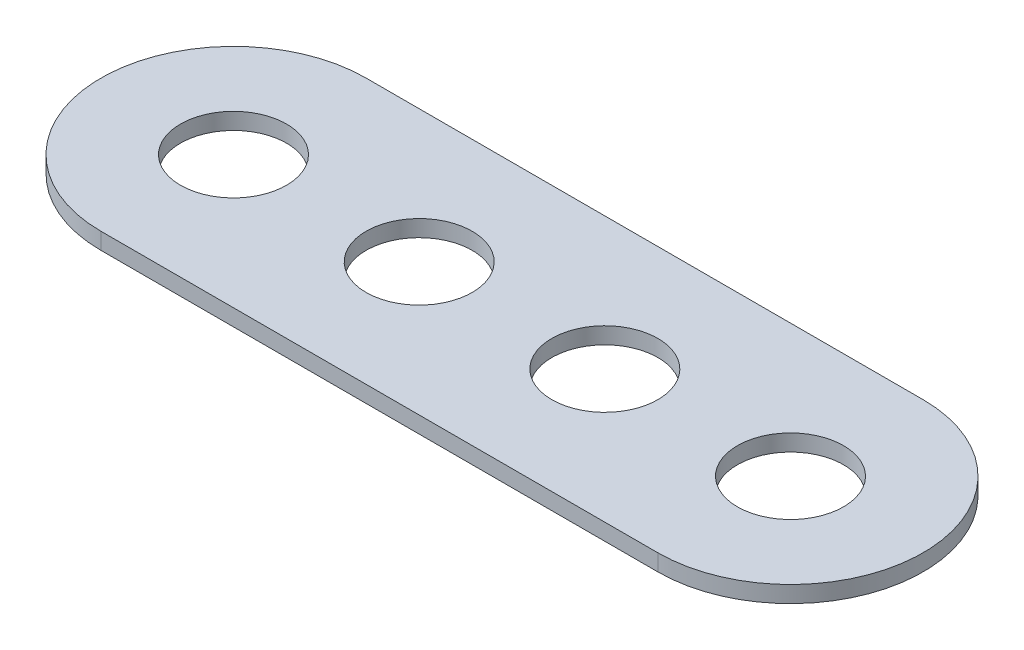
ISO-10303-21;
HEADER;
FILE_DESCRIPTION(('STEP AP214'),'2;1');
FILE_NAME('part.step','',(''),(''),'','','');
FILE_SCHEMA(('AUTOMOTIVE_DESIGN { 1 0 10303 214 1 1 1 1 }'));
ENDSEC;
DATA;
#1=APPLICATION_CONTEXT('core data for automotive mechanical design processes');
#2=APPLICATION_PROTOCOL_DEFINITION('international standard','automotive_design',2000,#1);
#3=PRODUCT_CONTEXT('',#1,'mechanical');
#4=PRODUCT('Part','Part','',(#3));
#5=PRODUCT_RELATED_PRODUCT_CATEGORY('part','',(#4));
#6=PRODUCT_DEFINITION_FORMATION('','',#4);
#7=PRODUCT_DEFINITION_CONTEXT('part definition',#1,'design');
#8=PRODUCT_DEFINITION('design','',#6,#7);
#9=PRODUCT_DEFINITION_SHAPE('','',#8);
#10=(LENGTH_UNIT() NAMED_UNIT(*) SI_UNIT(.MILLI.,.METRE.));
#11=(NAMED_UNIT(*) PLANE_ANGLE_UNIT() SI_UNIT($,.RADIAN.));
#12=(NAMED_UNIT(*) SI_UNIT($,.STERADIAN.) SOLID_ANGLE_UNIT());
#13=UNCERTAINTY_MEASURE_WITH_UNIT(LENGTH_MEASURE(1.E-05),#10,'distance_accuracy_value','');
#14=(GEOMETRIC_REPRESENTATION_CONTEXT(3) GLOBAL_UNCERTAINTY_ASSIGNED_CONTEXT((#13)) GLOBAL_UNIT_ASSIGNED_CONTEXT((#10,
#11,#12)) REPRESENTATION_CONTEXT('',''));
#15=CARTESIAN_POINT('',(0.,0.,0.));
#16=DIRECTION('',(0.,0.,1.));
#17=DIRECTION('',(1.,0.,0.));
#18=AXIS2_PLACEMENT_3D('',#15,#16,#17);
#19=CARTESIAN_POINT('',(0.,0.,0.));
#20=DIRECTION('',(0.,1.,0.));
#21=DIRECTION('',(0.,0.,1.));
#22=AXIS2_PLACEMENT_3D('',#19,#20,#21);
#23=CYLINDRICAL_SURFACE('',#22,10.16);
#24=CARTESIAN_POINT('',(0.,0.,0.));
#25=DIRECTION('',(0.,1.,0.));
#26=DIRECTION('',(0.,0.,1.));
#27=AXIS2_PLACEMENT_3D('',#24,#25,#26);
#28=CIRCLE('',#27,10.16);
#29=CARTESIAN_POINT('',(0.,0.,10.16));
#30=VERTEX_POINT('',#29);
#31=EDGE_CURVE('E48',#30,#30,#28,.T.);
#32=ORIENTED_EDGE('',*,*,#31,.F.);
#33=EDGE_LOOP('',(#32));
#34=FACE_BOUND('',#33,.T.);
#35=CARTESIAN_POINT('',(0.,3.175,0.));
#36=DIRECTION('',(0.,1.,0.));
#37=DIRECTION('',(0.,0.,1.));
#38=AXIS2_PLACEMENT_3D('',#35,#36,#37);
#39=CIRCLE('',#38,10.16);
#40=CARTESIAN_POINT('',(0.,3.175,10.16));
#41=VERTEX_POINT('',#40);
#42=EDGE_CURVE('E11',#41,#41,#39,.T.);
#43=ORIENTED_EDGE('',*,*,#42,.T.);
#44=EDGE_LOOP('',(#43));
#45=FACE_BOUND('',#44,.T.);
#46=ADVANCED_FACE('F39',(#34,#45),#23,.F.);
#47=CARTESIAN_POINT('',(-35.56,0.,0.));
#48=DIRECTION('',(0.,1.,0.));
#49=DIRECTION('',(0.,0.,1.));
#50=AXIS2_PLACEMENT_3D('',#47,#48,#49);
#51=CYLINDRICAL_SURFACE('',#50,10.16);
#52=CARTESIAN_POINT('',(-35.56,0.,0.));
#53=DIRECTION('',(0.,1.,0.));
#54=DIRECTION('',(0.,0.,1.));
#55=AXIS2_PLACEMENT_3D('',#52,#53,#54);
#56=CIRCLE('',#55,10.16);
#57=CARTESIAN_POINT('',(-35.56,0.,10.16));
#58=VERTEX_POINT('',#57);
#59=EDGE_CURVE('E136',#58,#58,#56,.T.);
#60=ORIENTED_EDGE('',*,*,#59,.F.);
#61=EDGE_LOOP('',(#60));
#62=FACE_BOUND('',#61,.T.);
#63=CARTESIAN_POINT('',(-35.56,3.175,0.));
#64=DIRECTION('',(0.,1.,0.));
#65=DIRECTION('',(0.,0.,1.));
#66=AXIS2_PLACEMENT_3D('',#63,#64,#65);
#67=CIRCLE('',#66,10.16);
#68=CARTESIAN_POINT('',(-35.56,3.175,10.16));
#69=VERTEX_POINT('',#68);
#70=EDGE_CURVE('E140',#69,#69,#67,.T.);
#71=ORIENTED_EDGE('',*,*,#70,.T.);
#72=EDGE_LOOP('',(#71));
#73=FACE_BOUND('',#72,.T.);
#74=ADVANCED_FACE('F152',(#62,#73),#51,.F.);
#75=CARTESIAN_POINT('',(-71.12,0.,0.));
#76=DIRECTION('',(0.,1.,0.));
#77=DIRECTION('',(0.,0.,1.));
#78=AXIS2_PLACEMENT_3D('',#75,#76,#77);
#79=CYLINDRICAL_SURFACE('',#78,10.16);
#80=CARTESIAN_POINT('',(-71.12,0.,0.));
#81=DIRECTION('',(0.,1.,0.));
#82=DIRECTION('',(0.,0.,1.));
#83=AXIS2_PLACEMENT_3D('',#80,#81,#82);
#84=CIRCLE('',#83,10.16);
#85=CARTESIAN_POINT('',(-71.12,0.,10.16));
#86=VERTEX_POINT('',#85);
#87=EDGE_CURVE('E128',#86,#86,#84,.T.);
#88=ORIENTED_EDGE('',*,*,#87,.F.);
#89=EDGE_LOOP('',(#88));
#90=FACE_BOUND('',#89,.T.);
#91=CARTESIAN_POINT('',(-71.12,3.175,0.));
#92=DIRECTION('',(0.,1.,0.));
#93=DIRECTION('',(0.,0.,1.));
#94=AXIS2_PLACEMENT_3D('',#91,#92,#93);
#95=CIRCLE('',#94,10.16);
#96=CARTESIAN_POINT('',(-71.12,3.175,10.16));
#97=VERTEX_POINT('',#96);
#98=EDGE_CURVE('E132',#97,#97,#95,.T.);
#99=ORIENTED_EDGE('',*,*,#98,.T.);
#100=EDGE_LOOP('',(#99));
#101=FACE_BOUND('',#100,.T.);
#102=ADVANCED_FACE('F194',(#90,#101),#79,.F.);
#103=CARTESIAN_POINT('',(0.,3.175,0.));
#104=DIRECTION('',(0.,-1.,0.));
#105=DIRECTION('',(0.,0.,-1.));
#106=AXIS2_PLACEMENT_3D('',#103,#104,#105);
#107=CYLINDRICAL_SURFACE('',#106,25.4);
#108=CARTESIAN_POINT('',(0.,0.,0.));
#109=DIRECTION('',(0.,1.,0.));
#110=DIRECTION('',(0.,0.,1.));
#111=AXIS2_PLACEMENT_3D('',#108,#109,#110);
#112=CIRCLE('',#111,25.4);
#113=CARTESIAN_POINT('',(0.,0.,25.4));
#114=VERTEX_POINT('',#113);
#115=CARTESIAN_POINT('',(0.,0.,-25.4));
#116=VERTEX_POINT('',#115);
#117=EDGE_CURVE('E111',#114,#116,#112,.T.);
#118=ORIENTED_EDGE('',*,*,#117,.T.);
#119=DIRECTION('',(0.,-1.,0.));
#120=VECTOR('',#119,1.);
#121=CARTESIAN_POINT('',(0.,3.175,-25.4));
#122=LINE('',#121,#120);
#123=CARTESIAN_POINT('',(0.,3.175,-25.4));
#124=VERTEX_POINT('',#123);
#125=EDGE_CURVE('E100',#124,#116,#122,.T.);
#126=ORIENTED_EDGE('',*,*,#125,.F.);
#127=CARTESIAN_POINT('',(0.,3.175,0.));
#128=DIRECTION('',(0.,1.,0.));
#129=DIRECTION('',(0.,0.,1.));
#130=AXIS2_PLACEMENT_3D('',#127,#128,#129);
#131=CIRCLE('',#130,25.4);
#132=CARTESIAN_POINT('',(0.,3.175,25.4));
#133=VERTEX_POINT('',#132);
#134=EDGE_CURVE('E92',#133,#124,#131,.T.);
#135=ORIENTED_EDGE('',*,*,#134,.F.);
#136=DIRECTION('',(0.,-1.,0.));
#137=VECTOR('',#136,1.);
#138=CARTESIAN_POINT('',(0.,3.175,25.4));
#139=LINE('',#138,#137);
#140=EDGE_CURVE('E107',#133,#114,#139,.T.);
#141=ORIENTED_EDGE('',*,*,#140,.T.);
#142=EDGE_LOOP('',(#118,#126,#135,#141));
#143=FACE_BOUND('',#142,.T.);
#144=ADVANCED_FACE('F191',(#143),#107,.T.);
#145=CARTESIAN_POINT('',(0.,3.175,-25.4));
#146=DIRECTION('',(0.,0.,1.));
#147=DIRECTION('',(1.,0.,0.));
#148=AXIS2_PLACEMENT_3D('',#145,#146,#147);
#149=PLANE('',#148);
#150=DIRECTION('',(-1.,0.,0.));
#151=VECTOR('',#150,1.);
#152=CARTESIAN_POINT('',(0.,0.,-25.4));
#153=LINE('',#152,#151);
#154=CARTESIAN_POINT('',(-106.68,0.,-25.4));
#155=VERTEX_POINT('',#154);
#156=EDGE_CURVE('E98',#116,#155,#153,.T.);
#157=ORIENTED_EDGE('',*,*,#156,.T.);
#158=DIRECTION('',(0.,-1.,0.));
#159=VECTOR('',#158,1.);
#160=CARTESIAN_POINT('',(-106.68,3.175,-25.4));
#161=LINE('',#160,#159);
#162=CARTESIAN_POINT('',(-106.68,3.175,-25.4));
#163=VERTEX_POINT('',#162);
#164=EDGE_CURVE('E96',#163,#155,#161,.T.);
#165=ORIENTED_EDGE('',*,*,#164,.F.);
#166=DIRECTION('',(-1.,0.,0.));
#167=VECTOR('',#166,1.);
#168=CARTESIAN_POINT('',(0.,3.175,-25.4));
#169=LINE('',#168,#167);
#170=EDGE_CURVE('E87',#124,#163,#169,.T.);
#171=ORIENTED_EDGE('',*,*,#170,.F.);
#172=ORIENTED_EDGE('',*,*,#125,.T.);
#173=EDGE_LOOP('',(#157,#165,#171,#172));
#174=FACE_BOUND('',#173,.T.);
#175=ADVANCED_FACE('F97',(#174),#149,.F.);
#176=CARTESIAN_POINT('',(-106.68,3.175,0.));
#177=DIRECTION('',(0.,-1.,0.));
#178=DIRECTION('',(0.,0.,-1.));
#179=AXIS2_PLACEMENT_3D('',#176,#177,#178);
#180=CYLINDRICAL_SURFACE('',#179,25.4);
#181=CARTESIAN_POINT('',(-106.68,0.,0.));
#182=DIRECTION('',(0.,1.,0.));
#183=DIRECTION('',(0.,0.,1.));
#184=AXIS2_PLACEMENT_3D('',#181,#182,#183);
#185=CIRCLE('',#184,25.4);
#186=CARTESIAN_POINT('',(-106.68,0.,25.4));
#187=VERTEX_POINT('',#186);
#188=EDGE_CURVE('E73',#155,#187,#185,.T.);
#189=ORIENTED_EDGE('',*,*,#188,.T.);
#190=DIRECTION('',(0.,-1.,0.));
#191=VECTOR('',#190,1.);
#192=CARTESIAN_POINT('',(-106.68,3.175,25.4));
#193=LINE('',#192,#191);
#194=CARTESIAN_POINT('',(-106.68,3.175,25.4));
#195=VERTEX_POINT('',#194);
#196=EDGE_CURVE('E101',#195,#187,#193,.T.);
#197=ORIENTED_EDGE('',*,*,#196,.F.);
#198=CARTESIAN_POINT('',(-106.68,3.175,0.));
#199=DIRECTION('',(0.,1.,0.));
#200=DIRECTION('',(0.,0.,1.));
#201=AXIS2_PLACEMENT_3D('',#198,#199,#200);
#202=CIRCLE('',#201,25.4);
#203=EDGE_CURVE('E90',#163,#195,#202,.T.);
#204=ORIENTED_EDGE('',*,*,#203,.F.);
#205=ORIENTED_EDGE('',*,*,#164,.T.);
#206=EDGE_LOOP('',(#189,#197,#204,#205));
#207=FACE_BOUND('',#206,.T.);
#208=ADVANCED_FACE('F103',(#207),#180,.T.);
#209=CARTESIAN_POINT('',(0.,3.175,25.4));
#210=DIRECTION('',(0.,0.,-1.));
#211=DIRECTION('',(-1.,0.,0.));
#212=AXIS2_PLACEMENT_3D('',#209,#210,#211);
#213=PLANE('',#212);
#214=DIRECTION('',(1.,0.,0.));
#215=VECTOR('',#214,1.);
#216=CARTESIAN_POINT('',(0.,0.,25.4));
#217=LINE('',#216,#215);
#218=EDGE_CURVE('E79',#187,#114,#217,.T.);
#219=ORIENTED_EDGE('',*,*,#218,.T.);
#220=ORIENTED_EDGE('',*,*,#140,.F.);
#221=DIRECTION('',(1.,0.,0.));
#222=VECTOR('',#221,1.);
#223=CARTESIAN_POINT('',(0.,3.175,25.4));
#224=LINE('',#223,#222);
#225=EDGE_CURVE('E56',#195,#133,#224,.T.);
#226=ORIENTED_EDGE('',*,*,#225,.F.);
#227=ORIENTED_EDGE('',*,*,#196,.T.);
#228=EDGE_LOOP('',(#219,#220,#226,#227));
#229=FACE_BOUND('',#228,.T.);
#230=ADVANCED_FACE('F157',(#229),#213,.F.);
#231=CARTESIAN_POINT('',(0.,3.175,0.));
#232=DIRECTION('',(0.,1.,0.));
#233=DIRECTION('',(0.,0.,1.));
#234=AXIS2_PLACEMENT_3D('',#231,#232,#233);
#235=PLANE('',#234);
#236=ORIENTED_EDGE('',*,*,#42,.F.);
#237=EDGE_LOOP('',(#236));
#238=FACE_BOUND('',#237,.T.);
#239=ORIENTED_EDGE('',*,*,#70,.F.);
#240=EDGE_LOOP('',(#239));
#241=FACE_BOUND('',#240,.T.);
#242=ORIENTED_EDGE('',*,*,#98,.F.);
#243=EDGE_LOOP('',(#242));
#244=FACE_BOUND('',#243,.T.);
#245=CARTESIAN_POINT('',(-106.68,3.175,0.));
#246=DIRECTION('',(0.,1.,0.));
#247=DIRECTION('',(0.,0.,1.));
#248=AXIS2_PLACEMENT_3D('',#245,#246,#247);
#249=CIRCLE('',#248,10.16);
#250=CARTESIAN_POINT('',(-106.68,3.175,10.16));
#251=VERTEX_POINT('',#250);
#252=EDGE_CURVE('E165',#251,#251,#249,.T.);
#253=ORIENTED_EDGE('',*,*,#252,.F.);
#254=EDGE_LOOP('',(#253));
#255=FACE_BOUND('',#254,.T.);
#256=ORIENTED_EDGE('',*,*,#134,.T.);
#257=ORIENTED_EDGE('',*,*,#170,.T.);
#258=ORIENTED_EDGE('',*,*,#203,.T.);
#259=ORIENTED_EDGE('',*,*,#225,.T.);
#260=EDGE_LOOP('',(#256,#257,#258,#259));
#261=FACE_BOUND('',#260,.T.);
#262=ADVANCED_FACE('F88',(#238,#241,#244,#255,#261),#235,.T.);
#263=CARTESIAN_POINT('',(0.,0.,0.));
#264=DIRECTION('',(0.,1.,0.));
#265=DIRECTION('',(0.,0.,1.));
#266=AXIS2_PLACEMENT_3D('',#263,#264,#265);
#267=PLANE('',#266);
#268=ORIENTED_EDGE('',*,*,#31,.T.);
#269=EDGE_LOOP('',(#268));
#270=FACE_BOUND('',#269,.T.);
#271=ORIENTED_EDGE('',*,*,#59,.T.);
#272=EDGE_LOOP('',(#271));
#273=FACE_BOUND('',#272,.T.);
#274=ORIENTED_EDGE('',*,*,#87,.T.);
#275=EDGE_LOOP('',(#274));
#276=FACE_BOUND('',#275,.T.);
#277=CARTESIAN_POINT('',(-106.68,0.,0.));
#278=DIRECTION('',(0.,1.,0.));
#279=DIRECTION('',(0.,0.,1.));
#280=AXIS2_PLACEMENT_3D('',#277,#278,#279);
#281=CIRCLE('',#280,10.16);
#282=CARTESIAN_POINT('',(-106.68,0.,10.16));
#283=VERTEX_POINT('',#282);
#284=EDGE_CURVE('E115',#283,#283,#281,.T.);
#285=ORIENTED_EDGE('',*,*,#284,.T.);
#286=EDGE_LOOP('',(#285));
#287=FACE_BOUND('',#286,.T.);
#288=ORIENTED_EDGE('',*,*,#117,.F.);
#289=ORIENTED_EDGE('',*,*,#218,.F.);
#290=ORIENTED_EDGE('',*,*,#188,.F.);
#291=ORIENTED_EDGE('',*,*,#156,.F.);
#292=EDGE_LOOP('',(#288,#289,#290,#291));
#293=FACE_BOUND('',#292,.T.);
#294=ADVANCED_FACE('F147',(#270,#273,#276,#287,#293),#267,.F.);
#295=CARTESIAN_POINT('',(-106.68,0.,0.));
#296=DIRECTION('',(0.,1.,0.));
#297=DIRECTION('',(0.,0.,1.));
#298=AXIS2_PLACEMENT_3D('',#295,#296,#297);
#299=CYLINDRICAL_SURFACE('',#298,10.16);
#300=ORIENTED_EDGE('',*,*,#284,.F.);
#301=EDGE_LOOP('',(#300));
#302=FACE_BOUND('',#301,.T.);
#303=ORIENTED_EDGE('',*,*,#252,.T.);
#304=EDGE_LOOP('',(#303));
#305=FACE_BOUND('',#304,.T.);
#306=ADVANCED_FACE('F177',(#302,#305),#299,.F.);
#307=CLOSED_SHELL('',(#46,#74,#102,#144,#175,#208,#230,#262,#294,#306));
#308=MANIFOLD_SOLID_BREP('B2',#307);
#309=ADVANCED_BREP_SHAPE_REPRESENTATION('',(#18,#308),#14);
#310=SHAPE_DEFINITION_REPRESENTATION(#9,#309);
ENDSEC;
END-ISO-10303-21;
